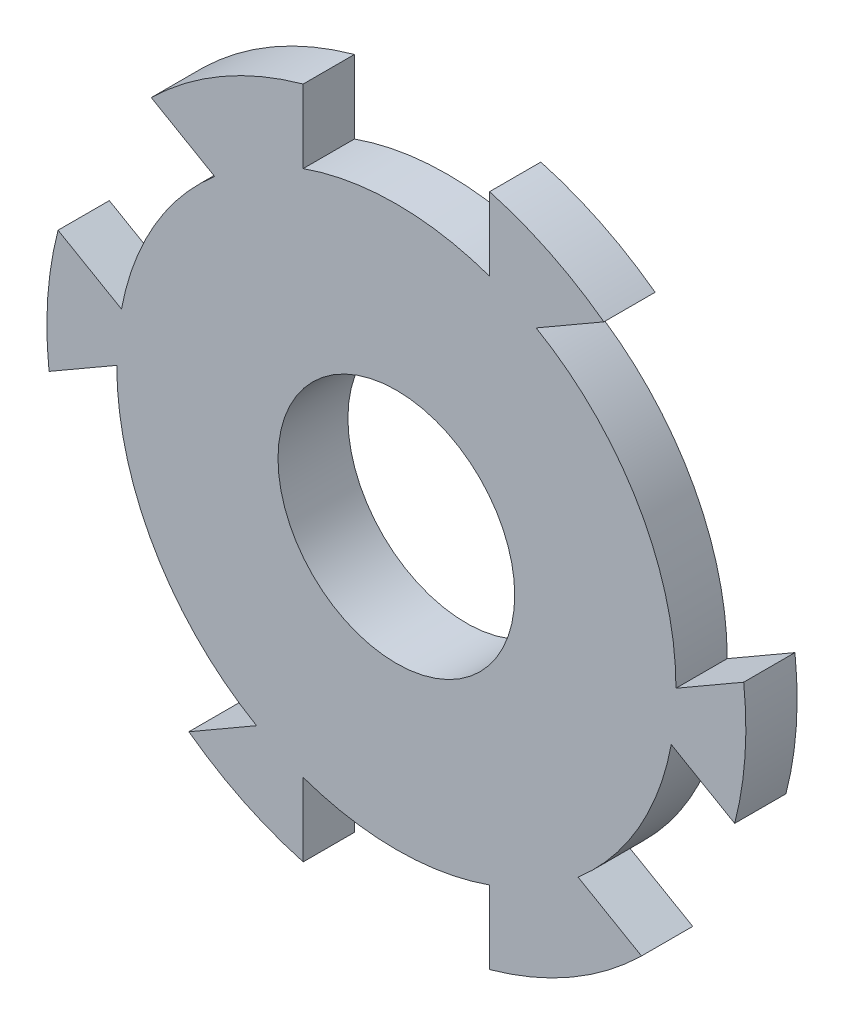
ISO-10303-21;
HEADER;
FILE_DESCRIPTION(('STEP AP214'),'2;1');
FILE_NAME('part.step','',(''),(''),'','','');
FILE_SCHEMA(('AUTOMOTIVE_DESIGN { 1 0 10303 214 1 1 1 1 }'));
ENDSEC;
DATA;
#1=APPLICATION_CONTEXT('core data for automotive mechanical design processes');
#2=APPLICATION_PROTOCOL_DEFINITION('international standard','automotive_design',2000,#1);
#3=PRODUCT_CONTEXT('',#1,'mechanical');
#4=PRODUCT('Part','Part','',(#3));
#5=PRODUCT_RELATED_PRODUCT_CATEGORY('part','',(#4));
#6=PRODUCT_DEFINITION_FORMATION('','',#4);
#7=PRODUCT_DEFINITION_CONTEXT('part definition',#1,'design');
#8=PRODUCT_DEFINITION('design','',#6,#7);
#9=PRODUCT_DEFINITION_SHAPE('','',#8);
#10=(LENGTH_UNIT() NAMED_UNIT(*) SI_UNIT(.MILLI.,.METRE.));
#11=(NAMED_UNIT(*) PLANE_ANGLE_UNIT() SI_UNIT($,.RADIAN.));
#12=(NAMED_UNIT(*) SI_UNIT($,.STERADIAN.) SOLID_ANGLE_UNIT());
#13=UNCERTAINTY_MEASURE_WITH_UNIT(LENGTH_MEASURE(1.E-05),#10,'distance_accuracy_value','');
#14=(GEOMETRIC_REPRESENTATION_CONTEXT(3) GLOBAL_UNCERTAINTY_ASSIGNED_CONTEXT((#13)) GLOBAL_UNIT_ASSIGNED_CONTEXT((#10,
#11,#12)) REPRESENTATION_CONTEXT('',''));
#15=CARTESIAN_POINT('',(0.,0.,0.));
#16=DIRECTION('',(0.,0.,1.));
#17=DIRECTION('',(1.,0.,0.));
#18=AXIS2_PLACEMENT_3D('',#15,#16,#17);
#19=CARTESIAN_POINT('',(0.,0.,0.));
#20=DIRECTION('',(0.,0.,1.));
#21=DIRECTION('',(1.,0.,0.));
#22=AXIS2_PLACEMENT_3D('',#19,#20,#21);
#23=PLANE('',#22);
#24=CARTESIAN_POINT('',(0.,0.,0.));
#25=DIRECTION('',(0.,0.,1.));
#26=DIRECTION('',(1.,0.,0.));
#27=AXIS2_PLACEMENT_3D('',#24,#25,#26);
#28=CIRCLE('',#27,7.62);
#29=CARTESIAN_POINT('',(-4.95170394666928,5.79180697404012,0.));
#30=VERTEX_POINT('',#29);
#31=CARTESIAN_POINT('',(-7.49170394666928,1.39239792281517,0.));
#32=VERTEX_POINT('',#31);
#33=EDGE_CURVE('E230',#30,#32,#28,.T.);
#34=ORIENTED_EDGE('',*,*,#33,.F.);
#35=DIRECTION('',(0.866025403784432,-0.500000000000011,0.));
#36=VECTOR('',#35,1.);
#37=CARTESIAN_POINT('',(-4.95170394666928,5.79180697404012,0.));
#38=LINE('',#37,#36);
#39=CARTESIAN_POINT('',(-6.68018985622362,6.78974877921182,0.));
#40=VERTEX_POINT('',#39);
#41=EDGE_CURVE('E135',#40,#30,#38,.T.);
#42=ORIENTED_EDGE('',*,*,#41,.F.);
#43=CARTESIAN_POINT('',(0.,0.,0.));
#44=DIRECTION('',(0.,0.,1.));
#45=DIRECTION('',(1.,0.,0.));
#46=AXIS2_PLACEMENT_3D('',#43,#44,#45);
#47=CIRCLE('',#46,9.52500000000004);
#48=CARTESIAN_POINT('',(-2.54000000000016,9.18008850719861,0.));
#49=VERTEX_POINT('',#48);
#50=EDGE_CURVE('E129',#49,#40,#47,.T.);
#51=ORIENTED_EDGE('',*,*,#50,.F.);
#52=DIRECTION('',(0.,1.,0.));
#53=VECTOR('',#52,1.);
#54=CARTESIAN_POINT('',(-2.54,7.18420489685532,0.));
#55=LINE('',#54,#53);
#56=CARTESIAN_POINT('',(-2.54,7.18420489685532,0.));
#57=VERTEX_POINT('',#56);
#58=EDGE_CURVE('E220',#57,#49,#55,.T.);
#59=ORIENTED_EDGE('',*,*,#58,.F.);
#60=CARTESIAN_POINT('',(0.,0.,0.));
#61=DIRECTION('',(0.,0.,1.));
#62=DIRECTION('',(1.,0.,0.));
#63=AXIS2_PLACEMENT_3D('',#60,#61,#62);
#64=CIRCLE('',#63,7.62);
#65=CARTESIAN_POINT('',(2.54,7.18420489685532,0.));
#66=VERTEX_POINT('',#65);
#67=EDGE_CURVE('E272',#66,#57,#64,.T.);
#68=ORIENTED_EDGE('',*,*,#67,.F.);
#69=DIRECTION('',(0.,-1.,0.));
#70=VECTOR('',#69,1.);
#71=CARTESIAN_POINT('',(2.54,7.18420489685532,0.));
#72=LINE('',#71,#70);
#73=CARTESIAN_POINT('',(2.53999999999985,9.18008850719866,0.));
#74=VERTEX_POINT('',#73);
#75=EDGE_CURVE('E270',#74,#66,#72,.T.);
#76=ORIENTED_EDGE('',*,*,#75,.F.);
#77=CARTESIAN_POINT('',(0.,0.,0.));
#78=DIRECTION('',(0.,0.,1.));
#79=DIRECTION('',(1.,0.,0.));
#80=AXIS2_PLACEMENT_3D('',#77,#78,#79);
#81=CIRCLE('',#80,9.52500000000004);
#82=CARTESIAN_POINT('',(5.65523437136697,7.66446013786427,0.));
#83=VERTEX_POINT('',#82);
#84=EDGE_CURVE('E268',#83,#74,#81,.T.);
#85=ORIENTED_EDGE('',*,*,#84,.F.);
#86=DIRECTION('',(0.866025403784419,0.500000000000034,0.));
#87=VECTOR('',#86,1.);
#88=CARTESIAN_POINT('',(3.80999999999992,6.59911357683747,0.));
#89=LINE('',#88,#87);
#90=CARTESIAN_POINT('',(3.80999999999992,6.59911357683747,0.));
#91=VERTEX_POINT('',#90);
#92=EDGE_CURVE('E266',#91,#83,#89,.T.);
#93=ORIENTED_EDGE('',*,*,#92,.F.);
#94=CARTESIAN_POINT('',(0.,0.,0.));
#95=DIRECTION('',(0.,0.,1.));
#96=DIRECTION('',(1.,0.,0.));
#97=AXIS2_PLACEMENT_3D('',#94,#95,#96);
#98=CIRCLE('',#97,7.62);
#99=CARTESIAN_POINT('',(7.62,0.,0.));
#100=VERTEX_POINT('',#99);
#101=EDGE_CURVE('E264',#100,#91,#98,.T.);
#102=ORIENTED_EDGE('',*,*,#101,.F.);
#103=DIRECTION('',(-0.866025403784411,-0.500000000000048,0.));
#104=VECTOR('',#103,1.);
#105=CARTESIAN_POINT('',(7.62,0.,0.));
#106=LINE('',#105,#104);
#107=CARTESIAN_POINT('',(9.46523437136711,1.06534656102697,0.));
#108=VERTEX_POINT('',#107);
#109=EDGE_CURVE('E262',#108,#100,#106,.T.);
#110=ORIENTED_EDGE('',*,*,#109,.F.);
#111=CARTESIAN_POINT('',(0.,0.,0.));
#112=DIRECTION('',(0.,0.,1.));
#113=DIRECTION('',(1.,0.,0.));
#114=AXIS2_PLACEMENT_3D('',#111,#112,#113);
#115=CIRCLE('',#114,9.52500000000007);
#116=CARTESIAN_POINT('',(9.22018985622369,-2.3903397279866,0.));
#117=VERTEX_POINT('',#116);
#118=EDGE_CURVE('E260',#117,#108,#115,.T.);
#119=ORIENTED_EDGE('',*,*,#118,.F.);
#120=DIRECTION('',(0.866025403784488,-0.499999999999914,0.));
#121=VECTOR('',#120,1.);
#122=CARTESIAN_POINT('',(7.49170394666929,-1.39239792281512,0.));
#123=LINE('',#122,#121);
#124=CARTESIAN_POINT('',(7.49170394666929,-1.39239792281512,0.));
#125=VERTEX_POINT('',#124);
#126=EDGE_CURVE('E258',#125,#117,#123,.T.);
#127=ORIENTED_EDGE('',*,*,#126,.F.);
#128=CARTESIAN_POINT('',(0.,0.,0.));
#129=DIRECTION('',(0.,0.,1.));
#130=DIRECTION('',(1.,0.,0.));
#131=AXIS2_PLACEMENT_3D('',#128,#129,#130);
#132=CIRCLE('',#131,7.62);
#133=CARTESIAN_POINT('',(4.95170394666932,-5.79180697404009,0.));
#134=VERTEX_POINT('',#133);
#135=EDGE_CURVE('E256',#134,#125,#132,.T.);
#136=ORIENTED_EDGE('',*,*,#135,.F.);
#137=DIRECTION('',(-0.866025403784475,0.499999999999938,0.));
#138=VECTOR('',#137,1.);
#139=CARTESIAN_POINT('',(4.95170394666932,-5.79180697404009,0.));
#140=LINE('',#139,#138);
#141=CARTESIAN_POINT('',(6.68018985622378,-6.78974877921167,0.));
#142=VERTEX_POINT('',#141);
#143=EDGE_CURVE('E254',#142,#134,#140,.T.);
#144=ORIENTED_EDGE('',*,*,#143,.F.);
#145=CARTESIAN_POINT('',(0.,0.,0.));
#146=DIRECTION('',(0.,0.,1.));
#147=DIRECTION('',(1.,0.,0.));
#148=AXIS2_PLACEMENT_3D('',#145,#146,#147);
#149=CIRCLE('',#148,9.52500000000004);
#150=CARTESIAN_POINT('',(2.54000000000022,-9.18008850719859,0.));
#151=VERTEX_POINT('',#150);
#152=EDGE_CURVE('E252',#151,#142,#149,.T.);
#153=ORIENTED_EDGE('',*,*,#152,.F.);
#154=DIRECTION('',(0.,-1.,0.));
#155=VECTOR('',#154,1.);
#156=CARTESIAN_POINT('',(2.54000000000005,-7.1842048968553,0.));
#157=LINE('',#156,#155);
#158=CARTESIAN_POINT('',(2.54000000000005,-7.1842048968553,0.));
#159=VERTEX_POINT('',#158);
#160=EDGE_CURVE('E250',#159,#151,#157,.T.);
#161=ORIENTED_EDGE('',*,*,#160,.F.);
#162=CARTESIAN_POINT('',(0.,0.,0.));
#163=DIRECTION('',(0.,0.,1.));
#164=DIRECTION('',(1.,0.,0.));
#165=AXIS2_PLACEMENT_3D('',#162,#163,#164);
#166=CIRCLE('',#165,7.62);
#167=CARTESIAN_POINT('',(-2.53999999999996,-7.18420489685534,0.));
#168=VERTEX_POINT('',#167);
#169=EDGE_CURVE('E248',#168,#159,#166,.T.);
#170=ORIENTED_EDGE('',*,*,#169,.F.);
#171=DIRECTION('',(0.,1.,0.));
#172=VECTOR('',#171,1.);
#173=CARTESIAN_POINT('',(-2.53999999999995,-7.18420489685534,0.));
#174=LINE('',#173,#172);
#175=CARTESIAN_POINT('',(-2.53999999999978,-9.18008850719868,0.));
#176=VERTEX_POINT('',#175);
#177=EDGE_CURVE('E246',#176,#168,#174,.T.);
#178=ORIENTED_EDGE('',*,*,#177,.F.);
#179=CARTESIAN_POINT('',(0.,0.,0.));
#180=DIRECTION('',(0.,0.,1.));
#181=DIRECTION('',(1.,0.,0.));
#182=AXIS2_PLACEMENT_3D('',#179,#180,#181);
#183=CIRCLE('',#182,9.52500000000004);
#184=CARTESIAN_POINT('',(-5.65523437136691,-7.66446013786431,0.));
#185=VERTEX_POINT('',#184);
#186=EDGE_CURVE('E244',#185,#176,#183,.T.);
#187=ORIENTED_EDGE('',*,*,#186,.F.);
#188=DIRECTION('',(-0.866025403784392,-0.500000000000081,0.));
#189=VECTOR('',#188,1.);
#190=CARTESIAN_POINT('',(-3.80999999999996,-6.59911357683745,0.));
#191=LINE('',#190,#189);
#192=CARTESIAN_POINT('',(-3.80999999999996,-6.59911357683745,0.));
#193=VERTEX_POINT('',#192);
#194=EDGE_CURVE('E242',#193,#185,#191,.T.);
#195=ORIENTED_EDGE('',*,*,#194,.F.);
#196=CARTESIAN_POINT('',(0.,0.,0.));
#197=DIRECTION('',(0.,0.,1.));
#198=DIRECTION('',(1.,0.,0.));
#199=AXIS2_PLACEMENT_3D('',#196,#197,#198);
#200=CIRCLE('',#199,7.62);
#201=CARTESIAN_POINT('',(-7.62,0.,0.));
#202=VERTEX_POINT('',#201);
#203=EDGE_CURVE('E240',#202,#193,#200,.T.);
#204=ORIENTED_EDGE('',*,*,#203,.F.);
#205=DIRECTION('',(0.866025403784404,0.50000000000006,0.));
#206=VECTOR('',#205,1.);
#207=CARTESIAN_POINT('',(-7.62,0.,0.));
#208=LINE('',#207,#206);
#209=CARTESIAN_POINT('',(-9.46523437136705,-1.06534656102692,0.));
#210=VERTEX_POINT('',#209);
#211=EDGE_CURVE('E238',#210,#202,#208,.T.);
#212=ORIENTED_EDGE('',*,*,#211,.F.);
#213=CARTESIAN_POINT('',(0.,0.,0.));
#214=DIRECTION('',(0.,0.,1.));
#215=DIRECTION('',(1.,0.,0.));
#216=AXIS2_PLACEMENT_3D('',#213,#214,#215);
#217=CIRCLE('',#216,9.52500000000004);
#218=CARTESIAN_POINT('',(-9.22018985622364,2.39033972798667,0.));
#219=VERTEX_POINT('',#218);
#220=EDGE_CURVE('E236',#219,#210,#217,.T.);
#221=ORIENTED_EDGE('',*,*,#220,.F.);
#222=DIRECTION('',(-0.866025403784481,0.499999999999927,0.));
#223=VECTOR('',#222,1.);
#224=CARTESIAN_POINT('',(-7.49170394666928,1.39239792281517,0.));
#225=LINE('',#224,#223);
#226=EDGE_CURVE('E233',#32,#219,#225,.T.);
#227=ORIENTED_EDGE('',*,*,#226,.F.);
#228=EDGE_LOOP('',(#34,#42,#51,#59,#68,#76,#85,#93,#102,#110,#119,#127,#136,#144,#153,#161,#170,
#178,#187,#195,#204,#212,#221,#227));
#229=FACE_BOUND('',#228,.T.);
#230=CARTESIAN_POINT('',(0.,0.,0.));
#231=DIRECTION('',(0.,0.,1.));
#232=DIRECTION('',(1.,0.,0.));
#233=AXIS2_PLACEMENT_3D('',#230,#231,#232);
#234=CIRCLE('',#233,4.7625);
#235=CARTESIAN_POINT('',(4.7625,0.,0.));
#236=VERTEX_POINT('',#235);
#237=EDGE_CURVE('E11',#236,#236,#234,.F.);
#238=ORIENTED_EDGE('',*,*,#237,.F.);
#239=EDGE_LOOP('',(#238));
#240=FACE_BOUND('',#239,.T.);
#241=ADVANCED_FACE('F35',(#229,#240),#23,.F.);
#242=CARTESIAN_POINT('',(0.,0.,1.397));
#243=DIRECTION('',(0.,0.,1.));
#244=DIRECTION('',(1.,0.,0.));
#245=AXIS2_PLACEMENT_3D('',#242,#243,#244);
#246=PLANE('',#245);
#247=CARTESIAN_POINT('',(0.,0.,1.397));
#248=DIRECTION('',(0.,0.,1.));
#249=DIRECTION('',(1.,0.,0.));
#250=AXIS2_PLACEMENT_3D('',#247,#248,#249);
#251=CIRCLE('',#250,7.62);
#252=CARTESIAN_POINT('',(-4.95170394666928,5.79180697404012,1.397));
#253=VERTEX_POINT('',#252);
#254=CARTESIAN_POINT('',(-7.49170394666928,1.39239792281517,1.397));
#255=VERTEX_POINT('',#254);
#256=EDGE_CURVE('E277',#253,#255,#251,.T.);
#257=ORIENTED_EDGE('',*,*,#256,.T.);
#258=DIRECTION('',(-0.866025403784481,0.499999999999927,0.));
#259=VECTOR('',#258,1.);
#260=CARTESIAN_POINT('',(-7.49170394666928,1.39239792281517,1.397));
#261=LINE('',#260,#259);
#262=CARTESIAN_POINT('',(-9.22018985622364,2.39033972798667,1.397));
#263=VERTEX_POINT('',#262);
#264=EDGE_CURVE('E144',#255,#263,#261,.T.);
#265=ORIENTED_EDGE('',*,*,#264,.T.);
#266=CARTESIAN_POINT('',(0.,0.,1.397));
#267=DIRECTION('',(0.,0.,1.));
#268=DIRECTION('',(1.,0.,0.));
#269=AXIS2_PLACEMENT_3D('',#266,#267,#268);
#270=CIRCLE('',#269,9.52500000000004);
#271=CARTESIAN_POINT('',(-9.46523437136705,-1.06534656102692,1.397));
#272=VERTEX_POINT('',#271);
#273=EDGE_CURVE('E358',#263,#272,#270,.T.);
#274=ORIENTED_EDGE('',*,*,#273,.T.);
#275=DIRECTION('',(0.866025403784404,0.50000000000006,0.));
#276=VECTOR('',#275,1.);
#277=CARTESIAN_POINT('',(-7.62,0.,1.397));
#278=LINE('',#277,#276);
#279=CARTESIAN_POINT('',(-7.62,0.,1.397));
#280=VERTEX_POINT('',#279);
#281=EDGE_CURVE('E355',#272,#280,#278,.T.);
#282=ORIENTED_EDGE('',*,*,#281,.T.);
#283=CARTESIAN_POINT('',(0.,0.,1.397));
#284=DIRECTION('',(0.,0.,1.));
#285=DIRECTION('',(1.,0.,0.));
#286=AXIS2_PLACEMENT_3D('',#283,#284,#285);
#287=CIRCLE('',#286,7.62);
#288=CARTESIAN_POINT('',(-3.80999999999996,-6.59911357683745,1.397));
#289=VERTEX_POINT('',#288);
#290=EDGE_CURVE('E357',#280,#289,#287,.T.);
#291=ORIENTED_EDGE('',*,*,#290,.T.);
#292=DIRECTION('',(-0.866025403784392,-0.500000000000081,0.));
#293=VECTOR('',#292,1.);
#294=CARTESIAN_POINT('',(-3.80999999999996,-6.59911357683745,1.397));
#295=LINE('',#294,#293);
#296=CARTESIAN_POINT('',(-5.65523437136691,-7.66446013786431,1.397));
#297=VERTEX_POINT('',#296);
#298=EDGE_CURVE('E360',#289,#297,#295,.T.);
#299=ORIENTED_EDGE('',*,*,#298,.T.);
#300=CARTESIAN_POINT('',(0.,0.,1.397));
#301=DIRECTION('',(0.,0.,1.));
#302=DIRECTION('',(1.,0.,0.));
#303=AXIS2_PLACEMENT_3D('',#300,#301,#302);
#304=CIRCLE('',#303,9.52500000000004);
#305=CARTESIAN_POINT('',(-2.53999999999978,-9.18008850719868,1.397));
#306=VERTEX_POINT('',#305);
#307=EDGE_CURVE('E366',#297,#306,#304,.T.);
#308=ORIENTED_EDGE('',*,*,#307,.T.);
#309=DIRECTION('',(0.,1.,0.));
#310=VECTOR('',#309,1.);
#311=CARTESIAN_POINT('',(-2.53999999999995,-7.18420489685534,1.397));
#312=LINE('',#311,#310);
#313=CARTESIAN_POINT('',(-2.53999999999996,-7.18420489685534,1.397));
#314=VERTEX_POINT('',#313);
#315=EDGE_CURVE('E368',#306,#314,#312,.T.);
#316=ORIENTED_EDGE('',*,*,#315,.T.);
#317=CARTESIAN_POINT('',(0.,0.,1.397));
#318=DIRECTION('',(0.,0.,1.));
#319=DIRECTION('',(1.,0.,0.));
#320=AXIS2_PLACEMENT_3D('',#317,#318,#319);
#321=CIRCLE('',#320,7.62);
#322=CARTESIAN_POINT('',(2.54000000000005,-7.1842048968553,1.397));
#323=VERTEX_POINT('',#322);
#324=EDGE_CURVE('E370',#314,#323,#321,.T.);
#325=ORIENTED_EDGE('',*,*,#324,.T.);
#326=DIRECTION('',(0.,-1.,0.));
#327=VECTOR('',#326,1.);
#328=CARTESIAN_POINT('',(2.54000000000005,-7.1842048968553,1.397));
#329=LINE('',#328,#327);
#330=CARTESIAN_POINT('',(2.54000000000022,-9.18008850719859,1.397));
#331=VERTEX_POINT('',#330);
#332=EDGE_CURVE('E372',#323,#331,#329,.T.);
#333=ORIENTED_EDGE('',*,*,#332,.T.);
#334=CARTESIAN_POINT('',(0.,0.,1.397));
#335=DIRECTION('',(0.,0.,1.));
#336=DIRECTION('',(1.,0.,0.));
#337=AXIS2_PLACEMENT_3D('',#334,#335,#336);
#338=CIRCLE('',#337,9.52500000000004);
#339=CARTESIAN_POINT('',(6.68018985622378,-6.78974877921167,1.397));
#340=VERTEX_POINT('',#339);
#341=EDGE_CURVE('E374',#331,#340,#338,.T.);
#342=ORIENTED_EDGE('',*,*,#341,.T.);
#343=DIRECTION('',(-0.866025403784475,0.499999999999938,0.));
#344=VECTOR('',#343,1.);
#345=CARTESIAN_POINT('',(4.95170394666932,-5.79180697404009,1.397));
#346=LINE('',#345,#344);
#347=CARTESIAN_POINT('',(4.95170394666932,-5.79180697404009,1.397));
#348=VERTEX_POINT('',#347);
#349=EDGE_CURVE('E376',#340,#348,#346,.T.);
#350=ORIENTED_EDGE('',*,*,#349,.T.);
#351=CARTESIAN_POINT('',(0.,0.,1.397));
#352=DIRECTION('',(0.,0.,1.));
#353=DIRECTION('',(1.,0.,0.));
#354=AXIS2_PLACEMENT_3D('',#351,#352,#353);
#355=CIRCLE('',#354,7.62);
#356=CARTESIAN_POINT('',(7.49170394666929,-1.39239792281512,1.397));
#357=VERTEX_POINT('',#356);
#358=EDGE_CURVE('E378',#348,#357,#355,.T.);
#359=ORIENTED_EDGE('',*,*,#358,.T.);
#360=DIRECTION('',(0.866025403784488,-0.499999999999914,0.));
#361=VECTOR('',#360,1.);
#362=CARTESIAN_POINT('',(7.49170394666929,-1.39239792281512,1.397));
#363=LINE('',#362,#361);
#364=CARTESIAN_POINT('',(9.22018985622369,-2.3903397279866,1.397));
#365=VERTEX_POINT('',#364);
#366=EDGE_CURVE('E380',#357,#365,#363,.T.);
#367=ORIENTED_EDGE('',*,*,#366,.T.);
#368=CARTESIAN_POINT('',(0.,0.,1.397));
#369=DIRECTION('',(0.,0.,1.));
#370=DIRECTION('',(1.,0.,0.));
#371=AXIS2_PLACEMENT_3D('',#368,#369,#370);
#372=CIRCLE('',#371,9.52500000000007);
#373=CARTESIAN_POINT('',(9.46523437136711,1.06534656102697,1.397));
#374=VERTEX_POINT('',#373);
#375=EDGE_CURVE('E382',#365,#374,#372,.T.);
#376=ORIENTED_EDGE('',*,*,#375,.T.);
#377=DIRECTION('',(-0.866025403784411,-0.500000000000048,0.));
#378=VECTOR('',#377,1.);
#379=CARTESIAN_POINT('',(7.62,0.,1.397));
#380=LINE('',#379,#378);
#381=CARTESIAN_POINT('',(7.62,0.,1.397));
#382=VERTEX_POINT('',#381);
#383=EDGE_CURVE('E384',#374,#382,#380,.T.);
#384=ORIENTED_EDGE('',*,*,#383,.T.);
#385=CARTESIAN_POINT('',(0.,0.,1.397));
#386=DIRECTION('',(0.,0.,1.));
#387=DIRECTION('',(1.,0.,0.));
#388=AXIS2_PLACEMENT_3D('',#385,#386,#387);
#389=CIRCLE('',#388,7.62);
#390=CARTESIAN_POINT('',(3.80999999999992,6.59911357683747,1.397));
#391=VERTEX_POINT('',#390);
#392=EDGE_CURVE('E386',#382,#391,#389,.T.);
#393=ORIENTED_EDGE('',*,*,#392,.T.);
#394=DIRECTION('',(0.866025403784419,0.500000000000034,0.));
#395=VECTOR('',#394,1.);
#396=CARTESIAN_POINT('',(3.80999999999992,6.59911357683747,1.397));
#397=LINE('',#396,#395);
#398=CARTESIAN_POINT('',(5.65523437136697,7.66446013786427,1.397));
#399=VERTEX_POINT('',#398);
#400=EDGE_CURVE('E388',#391,#399,#397,.T.);
#401=ORIENTED_EDGE('',*,*,#400,.T.);
#402=CARTESIAN_POINT('',(0.,0.,1.397));
#403=DIRECTION('',(0.,0.,1.));
#404=DIRECTION('',(1.,0.,0.));
#405=AXIS2_PLACEMENT_3D('',#402,#403,#404);
#406=CIRCLE('',#405,9.52500000000004);
#407=CARTESIAN_POINT('',(2.53999999999985,9.18008850719866,1.397));
#408=VERTEX_POINT('',#407);
#409=EDGE_CURVE('E390',#399,#408,#406,.T.);
#410=ORIENTED_EDGE('',*,*,#409,.T.);
#411=DIRECTION('',(0.,-1.,0.));
#412=VECTOR('',#411,1.);
#413=CARTESIAN_POINT('',(2.54,7.18420489685532,1.397));
#414=LINE('',#413,#412);
#415=CARTESIAN_POINT('',(2.54,7.18420489685532,1.397));
#416=VERTEX_POINT('',#415);
#417=EDGE_CURVE('E392',#408,#416,#414,.T.);
#418=ORIENTED_EDGE('',*,*,#417,.T.);
#419=CARTESIAN_POINT('',(0.,0.,1.397));
#420=DIRECTION('',(0.,0.,1.));
#421=DIRECTION('',(1.,0.,0.));
#422=AXIS2_PLACEMENT_3D('',#419,#420,#421);
#423=CIRCLE('',#422,7.62);
#424=CARTESIAN_POINT('',(-2.54,7.18420489685532,1.397));
#425=VERTEX_POINT('',#424);
#426=EDGE_CURVE('E212',#416,#425,#423,.T.);
#427=ORIENTED_EDGE('',*,*,#426,.T.);
#428=DIRECTION('',(0.,1.,0.));
#429=VECTOR('',#428,1.);
#430=CARTESIAN_POINT('',(-2.54,7.18420489685532,1.397));
#431=LINE('',#430,#429);
#432=CARTESIAN_POINT('',(-2.54000000000016,9.18008850719861,1.397));
#433=VERTEX_POINT('',#432);
#434=EDGE_CURVE('E205',#425,#433,#431,.T.);
#435=ORIENTED_EDGE('',*,*,#434,.T.);
#436=CARTESIAN_POINT('',(0.,0.,1.397));
#437=DIRECTION('',(0.,0.,1.));
#438=DIRECTION('',(1.,0.,0.));
#439=AXIS2_PLACEMENT_3D('',#436,#437,#438);
#440=CIRCLE('',#439,9.52500000000004);
#441=CARTESIAN_POINT('',(-6.68018985622362,6.78974877921182,1.397));
#442=VERTEX_POINT('',#441);
#443=EDGE_CURVE('E210',#433,#442,#440,.T.);
#444=ORIENTED_EDGE('',*,*,#443,.T.);
#445=DIRECTION('',(0.866025403784432,-0.500000000000011,0.));
#446=VECTOR('',#445,1.);
#447=CARTESIAN_POINT('',(-4.95170394666928,5.79180697404012,1.397));
#448=LINE('',#447,#446);
#449=EDGE_CURVE('E52',#442,#253,#448,.T.);
#450=ORIENTED_EDGE('',*,*,#449,.T.);
#451=EDGE_LOOP('',(#257,#265,#274,#282,#291,#299,#308,#316,#325,#333,#342,#350,#359,#367,#376,
#384,#393,#401,#410,#418,#427,#435,#444,#450));
#452=FACE_BOUND('',#451,.T.);
#453=CARTESIAN_POINT('',(0.,0.,1.397));
#454=DIRECTION('',(0.,0.,1.));
#455=DIRECTION('',(1.,0.,0.));
#456=AXIS2_PLACEMENT_3D('',#453,#454,#455);
#457=CIRCLE('',#456,3.2258);
#458=CARTESIAN_POINT('',(3.2258,0.,1.397));
#459=VERTEX_POINT('',#458);
#460=EDGE_CURVE('E234',#459,#459,#457,.T.);
#461=ORIENTED_EDGE('',*,*,#460,.F.);
#462=EDGE_LOOP('',(#461));
#463=FACE_BOUND('',#462,.T.);
#464=ADVANCED_FACE('F207',(#452,#463),#246,.T.);
#465=CARTESIAN_POINT('',(0.,0.,1.397));
#466=DIRECTION('',(0.,0.,-1.));
#467=DIRECTION('',(-1.,0.,0.));
#468=AXIS2_PLACEMENT_3D('',#465,#466,#467);
#469=CYLINDRICAL_SURFACE('',#468,7.62);
#470=ORIENTED_EDGE('',*,*,#33,.T.);
#471=DIRECTION('',(0.,0.,-1.));
#472=VECTOR('',#471,1.);
#473=CARTESIAN_POINT('',(-7.49170394666928,1.39239792281517,1.397));
#474=LINE('',#473,#472);
#475=EDGE_CURVE('E44',#255,#32,#474,.T.);
#476=ORIENTED_EDGE('',*,*,#475,.F.);
#477=ORIENTED_EDGE('',*,*,#256,.F.);
#478=DIRECTION('',(0.,0.,-1.));
#479=VECTOR('',#478,1.);
#480=CARTESIAN_POINT('',(-4.95170394666928,5.79180697404012,1.397));
#481=LINE('',#480,#479);
#482=EDGE_CURVE('E226',#253,#30,#481,.T.);
#483=ORIENTED_EDGE('',*,*,#482,.T.);
#484=EDGE_LOOP('',(#470,#476,#477,#483));
#485=FACE_BOUND('',#484,.T.);
#486=ADVANCED_FACE('F37',(#485),#469,.T.);
#487=CARTESIAN_POINT('',(-7.49170394666928,1.39239792281517,1.397));
#488=DIRECTION('',(-0.499999999999927,-0.866025403784481,0.));
#489=DIRECTION('',(0.866025403784481,-0.499999999999927,0.));
#490=AXIS2_PLACEMENT_3D('',#487,#488,#489);
#491=PLANE('',#490);
#492=ORIENTED_EDGE('',*,*,#226,.T.);
#493=DIRECTION('',(0.,0.,-1.));
#494=VECTOR('',#493,1.);
#495=CARTESIAN_POINT('',(-9.22018985622364,2.39033972798667,1.397));
#496=LINE('',#495,#494);
#497=EDGE_CURVE('E335',#263,#219,#496,.T.);
#498=ORIENTED_EDGE('',*,*,#497,.F.);
#499=ORIENTED_EDGE('',*,*,#264,.F.);
#500=ORIENTED_EDGE('',*,*,#475,.T.);
#501=EDGE_LOOP('',(#492,#498,#499,#500));
#502=FACE_BOUND('',#501,.T.);
#503=ADVANCED_FACE('F338',(#502),#491,.F.);
#504=CARTESIAN_POINT('',(0.,0.,1.397));
#505=DIRECTION('',(0.,0.,-1.));
#506=DIRECTION('',(-1.,0.,0.));
#507=AXIS2_PLACEMENT_3D('',#504,#505,#506);
#508=CYLINDRICAL_SURFACE('',#507,9.52500000000004);
#509=ORIENTED_EDGE('',*,*,#220,.T.);
#510=DIRECTION('',(0.,0.,-1.));
#511=VECTOR('',#510,1.);
#512=CARTESIAN_POINT('',(-9.46523437136705,-1.06534656102692,1.397));
#513=LINE('',#512,#511);
#514=EDGE_CURVE('E332',#272,#210,#513,.T.);
#515=ORIENTED_EDGE('',*,*,#514,.F.);
#516=ORIENTED_EDGE('',*,*,#273,.F.);
#517=ORIENTED_EDGE('',*,*,#497,.T.);
#518=EDGE_LOOP('',(#509,#515,#516,#517));
#519=FACE_BOUND('',#518,.T.);
#520=ADVANCED_FACE('F349',(#519),#508,.T.);
#521=CARTESIAN_POINT('',(-7.62,0.,1.397));
#522=DIRECTION('',(-0.50000000000006,0.866025403784404,0.));
#523=DIRECTION('',(-0.866025403784404,-0.50000000000006,0.));
#524=AXIS2_PLACEMENT_3D('',#521,#522,#523);
#525=PLANE('',#524);
#526=ORIENTED_EDGE('',*,*,#211,.T.);
#527=DIRECTION('',(0.,0.,-1.));
#528=VECTOR('',#527,1.);
#529=CARTESIAN_POINT('',(-7.62,0.,1.397));
#530=LINE('',#529,#528);
#531=EDGE_CURVE('E329',#280,#202,#530,.T.);
#532=ORIENTED_EDGE('',*,*,#531,.F.);
#533=ORIENTED_EDGE('',*,*,#281,.F.);
#534=ORIENTED_EDGE('',*,*,#514,.T.);
#535=EDGE_LOOP('',(#526,#532,#533,#534));
#536=FACE_BOUND('',#535,.T.);
#537=ADVANCED_FACE('F353',(#536),#525,.F.);
#538=CARTESIAN_POINT('',(0.,0.,1.397));
#539=DIRECTION('',(0.,0.,-1.));
#540=DIRECTION('',(-1.,0.,0.));
#541=AXIS2_PLACEMENT_3D('',#538,#539,#540);
#542=CYLINDRICAL_SURFACE('',#541,7.62);
#543=ORIENTED_EDGE('',*,*,#203,.T.);
#544=DIRECTION('',(0.,0.,-1.));
#545=VECTOR('',#544,1.);
#546=CARTESIAN_POINT('',(-3.80999999999996,-6.59911357683745,1.397));
#547=LINE('',#546,#545);
#548=EDGE_CURVE('E326',#289,#193,#547,.T.);
#549=ORIENTED_EDGE('',*,*,#548,.F.);
#550=ORIENTED_EDGE('',*,*,#290,.F.);
#551=ORIENTED_EDGE('',*,*,#531,.T.);
#552=EDGE_LOOP('',(#543,#549,#550,#551));
#553=FACE_BOUND('',#552,.T.);
#554=ADVANCED_FACE('F473',(#553),#542,.T.);
#555=CARTESIAN_POINT('',(-3.80999999999996,-6.59911357683745,1.397));
#556=DIRECTION('',(0.500000000000081,-0.866025403784392,0.));
#557=DIRECTION('',(0.866025403784392,0.500000000000081,0.));
#558=AXIS2_PLACEMENT_3D('',#555,#556,#557);
#559=PLANE('',#558);
#560=ORIENTED_EDGE('',*,*,#194,.T.);
#561=DIRECTION('',(0.,0.,-1.));
#562=VECTOR('',#561,1.);
#563=CARTESIAN_POINT('',(-5.65523437136691,-7.66446013786431,1.397));
#564=LINE('',#563,#562);
#565=EDGE_CURVE('E323',#297,#185,#564,.T.);
#566=ORIENTED_EDGE('',*,*,#565,.F.);
#567=ORIENTED_EDGE('',*,*,#298,.F.);
#568=ORIENTED_EDGE('',*,*,#548,.T.);
#569=EDGE_LOOP('',(#560,#566,#567,#568));
#570=FACE_BOUND('',#569,.T.);
#571=ADVANCED_FACE('F470',(#570),#559,.F.);
#572=CARTESIAN_POINT('',(0.,0.,1.397));
#573=DIRECTION('',(0.,0.,-1.));
#574=DIRECTION('',(-1.,0.,0.));
#575=AXIS2_PLACEMENT_3D('',#572,#573,#574);
#576=CYLINDRICAL_SURFACE('',#575,9.52500000000004);
#577=ORIENTED_EDGE('',*,*,#186,.T.);
#578=DIRECTION('',(0.,0.,-1.));
#579=VECTOR('',#578,1.);
#580=CARTESIAN_POINT('',(-2.53999999999978,-9.18008850719868,1.397));
#581=LINE('',#580,#579);
#582=EDGE_CURVE('E320',#306,#176,#581,.T.);
#583=ORIENTED_EDGE('',*,*,#582,.F.);
#584=ORIENTED_EDGE('',*,*,#307,.F.);
#585=ORIENTED_EDGE('',*,*,#565,.T.);
#586=EDGE_LOOP('',(#577,#583,#584,#585));
#587=FACE_BOUND('',#586,.T.);
#588=ADVANCED_FACE('F465',(#587),#576,.T.);
#589=CARTESIAN_POINT('',(-2.53999999999995,-7.18420489685534,1.397));
#590=DIRECTION('',(-1.,0.,0.));
#591=DIRECTION('',(0.,-1.,0.));
#592=AXIS2_PLACEMENT_3D('',#589,#590,#591);
#593=PLANE('',#592);
#594=ORIENTED_EDGE('',*,*,#177,.T.);
#595=DIRECTION('',(0.,0.,-1.));
#596=VECTOR('',#595,1.);
#597=CARTESIAN_POINT('',(-2.53999999999996,-7.18420489685534,1.397));
#598=LINE('',#597,#596);
#599=EDGE_CURVE('E317',#314,#168,#598,.T.);
#600=ORIENTED_EDGE('',*,*,#599,.F.);
#601=ORIENTED_EDGE('',*,*,#315,.F.);
#602=ORIENTED_EDGE('',*,*,#582,.T.);
#603=EDGE_LOOP('',(#594,#600,#601,#602));
#604=FACE_BOUND('',#603,.T.);
#605=ADVANCED_FACE('F460',(#604),#593,.F.);
#606=CARTESIAN_POINT('',(0.,0.,1.397));
#607=DIRECTION('',(0.,0.,-1.));
#608=DIRECTION('',(-1.,0.,0.));
#609=AXIS2_PLACEMENT_3D('',#606,#607,#608);
#610=CYLINDRICAL_SURFACE('',#609,7.62);
#611=ORIENTED_EDGE('',*,*,#169,.T.);
#612=DIRECTION('',(0.,0.,-1.));
#613=VECTOR('',#612,1.);
#614=CARTESIAN_POINT('',(2.54000000000005,-7.1842048968553,1.397));
#615=LINE('',#614,#613);
#616=EDGE_CURVE('E314',#323,#159,#615,.T.);
#617=ORIENTED_EDGE('',*,*,#616,.F.);
#618=ORIENTED_EDGE('',*,*,#324,.F.);
#619=ORIENTED_EDGE('',*,*,#599,.T.);
#620=EDGE_LOOP('',(#611,#617,#618,#619));
#621=FACE_BOUND('',#620,.T.);
#622=ADVANCED_FACE('F456',(#621),#610,.T.);
#623=CARTESIAN_POINT('',(2.54000000000005,-7.1842048968553,1.397));
#624=DIRECTION('',(1.,0.,0.));
#625=DIRECTION('',(0.,1.,0.));
#626=AXIS2_PLACEMENT_3D('',#623,#624,#625);
#627=PLANE('',#626);
#628=ORIENTED_EDGE('',*,*,#160,.T.);
#629=DIRECTION('',(0.,0.,-1.));
#630=VECTOR('',#629,1.);
#631=CARTESIAN_POINT('',(2.54000000000022,-9.18008850719859,1.397));
#632=LINE('',#631,#630);
#633=EDGE_CURVE('E311',#331,#151,#632,.T.);
#634=ORIENTED_EDGE('',*,*,#633,.F.);
#635=ORIENTED_EDGE('',*,*,#332,.F.);
#636=ORIENTED_EDGE('',*,*,#616,.T.);
#637=EDGE_LOOP('',(#628,#634,#635,#636));
#638=FACE_BOUND('',#637,.T.);
#639=ADVANCED_FACE('F451',(#638),#627,.F.);
#640=CARTESIAN_POINT('',(0.,0.,1.397));
#641=DIRECTION('',(0.,0.,-1.));
#642=DIRECTION('',(-1.,0.,0.));
#643=AXIS2_PLACEMENT_3D('',#640,#641,#642);
#644=CYLINDRICAL_SURFACE('',#643,9.52500000000004);
#645=ORIENTED_EDGE('',*,*,#152,.T.);
#646=DIRECTION('',(0.,0.,-1.));
#647=VECTOR('',#646,1.);
#648=CARTESIAN_POINT('',(6.68018985622378,-6.78974877921167,1.397));
#649=LINE('',#648,#647);
#650=EDGE_CURVE('E308',#340,#142,#649,.T.);
#651=ORIENTED_EDGE('',*,*,#650,.F.);
#652=ORIENTED_EDGE('',*,*,#341,.F.);
#653=ORIENTED_EDGE('',*,*,#633,.T.);
#654=EDGE_LOOP('',(#645,#651,#652,#653));
#655=FACE_BOUND('',#654,.T.);
#656=ADVANCED_FACE('F445',(#655),#644,.T.);
#657=CARTESIAN_POINT('',(4.95170394666932,-5.79180697404009,1.397));
#658=DIRECTION('',(-0.499999999999938,-0.866025403784475,0.));
#659=DIRECTION('',(0.866025403784475,-0.499999999999938,0.));
#660=AXIS2_PLACEMENT_3D('',#657,#658,#659);
#661=PLANE('',#660);
#662=ORIENTED_EDGE('',*,*,#143,.T.);
#663=DIRECTION('',(0.,0.,-1.));
#664=VECTOR('',#663,1.);
#665=CARTESIAN_POINT('',(4.95170394666932,-5.79180697404009,1.397));
#666=LINE('',#665,#664);
#667=EDGE_CURVE('E305',#348,#134,#666,.T.);
#668=ORIENTED_EDGE('',*,*,#667,.F.);
#669=ORIENTED_EDGE('',*,*,#349,.F.);
#670=ORIENTED_EDGE('',*,*,#650,.T.);
#671=EDGE_LOOP('',(#662,#668,#669,#670));
#672=FACE_BOUND('',#671,.T.);
#673=ADVANCED_FACE('F441',(#672),#661,.F.);
#674=CARTESIAN_POINT('',(0.,0.,1.397));
#675=DIRECTION('',(0.,0.,-1.));
#676=DIRECTION('',(-1.,0.,0.));
#677=AXIS2_PLACEMENT_3D('',#674,#675,#676);
#678=CYLINDRICAL_SURFACE('',#677,7.62);
#679=ORIENTED_EDGE('',*,*,#135,.T.);
#680=DIRECTION('',(0.,0.,-1.));
#681=VECTOR('',#680,1.);
#682=CARTESIAN_POINT('',(7.49170394666929,-1.39239792281512,1.397));
#683=LINE('',#682,#681);
#684=EDGE_CURVE('E302',#357,#125,#683,.T.);
#685=ORIENTED_EDGE('',*,*,#684,.F.);
#686=ORIENTED_EDGE('',*,*,#358,.F.);
#687=ORIENTED_EDGE('',*,*,#667,.T.);
#688=EDGE_LOOP('',(#679,#685,#686,#687));
#689=FACE_BOUND('',#688,.T.);
#690=ADVANCED_FACE('F436',(#689),#678,.T.);
#691=CARTESIAN_POINT('',(7.49170394666929,-1.39239792281512,1.397));
#692=DIRECTION('',(0.499999999999914,0.866025403784488,0.));
#693=DIRECTION('',(-0.866025403784488,0.499999999999914,0.));
#694=AXIS2_PLACEMENT_3D('',#691,#692,#693);
#695=PLANE('',#694);
#696=ORIENTED_EDGE('',*,*,#126,.T.);
#697=DIRECTION('',(0.,0.,-1.));
#698=VECTOR('',#697,1.);
#699=CARTESIAN_POINT('',(9.22018985622369,-2.3903397279866,1.397));
#700=LINE('',#699,#698);
#701=EDGE_CURVE('E299',#365,#117,#700,.T.);
#702=ORIENTED_EDGE('',*,*,#701,.F.);
#703=ORIENTED_EDGE('',*,*,#366,.F.);
#704=ORIENTED_EDGE('',*,*,#684,.T.);
#705=EDGE_LOOP('',(#696,#702,#703,#704));
#706=FACE_BOUND('',#705,.T.);
#707=ADVANCED_FACE('F430',(#706),#695,.F.);
#708=CARTESIAN_POINT('',(0.,0.,1.397));
#709=DIRECTION('',(0.,0.,-1.));
#710=DIRECTION('',(-1.,0.,0.));
#711=AXIS2_PLACEMENT_3D('',#708,#709,#710);
#712=CYLINDRICAL_SURFACE('',#711,9.52500000000007);
#713=ORIENTED_EDGE('',*,*,#118,.T.);
#714=DIRECTION('',(0.,0.,-1.));
#715=VECTOR('',#714,1.);
#716=CARTESIAN_POINT('',(9.46523437136711,1.06534656102697,1.397));
#717=LINE('',#716,#715);
#718=EDGE_CURVE('E296',#374,#108,#717,.T.);
#719=ORIENTED_EDGE('',*,*,#718,.F.);
#720=ORIENTED_EDGE('',*,*,#375,.F.);
#721=ORIENTED_EDGE('',*,*,#701,.T.);
#722=EDGE_LOOP('',(#713,#719,#720,#721));
#723=FACE_BOUND('',#722,.T.);
#724=ADVANCED_FACE('F426',(#723),#712,.T.);
#725=CARTESIAN_POINT('',(7.62,0.,1.397));
#726=DIRECTION('',(0.500000000000048,-0.866025403784411,0.));
#727=DIRECTION('',(0.866025403784411,0.500000000000048,0.));
#728=AXIS2_PLACEMENT_3D('',#725,#726,#727);
#729=PLANE('',#728);
#730=ORIENTED_EDGE('',*,*,#109,.T.);
#731=DIRECTION('',(0.,0.,-1.));
#732=VECTOR('',#731,1.);
#733=CARTESIAN_POINT('',(7.62,0.,1.397));
#734=LINE('',#733,#732);
#735=EDGE_CURVE('E293',#382,#100,#734,.T.);
#736=ORIENTED_EDGE('',*,*,#735,.F.);
#737=ORIENTED_EDGE('',*,*,#383,.F.);
#738=ORIENTED_EDGE('',*,*,#718,.T.);
#739=EDGE_LOOP('',(#730,#736,#737,#738));
#740=FACE_BOUND('',#739,.T.);
#741=ADVANCED_FACE('F421',(#740),#729,.F.);
#742=CARTESIAN_POINT('',(0.,0.,1.397));
#743=DIRECTION('',(0.,0.,-1.));
#744=DIRECTION('',(-1.,0.,0.));
#745=AXIS2_PLACEMENT_3D('',#742,#743,#744);
#746=CYLINDRICAL_SURFACE('',#745,7.62);
#747=ORIENTED_EDGE('',*,*,#101,.T.);
#748=DIRECTION('',(0.,0.,-1.));
#749=VECTOR('',#748,1.);
#750=CARTESIAN_POINT('',(3.80999999999992,6.59911357683747,1.397));
#751=LINE('',#750,#749);
#752=EDGE_CURVE('E290',#391,#91,#751,.T.);
#753=ORIENTED_EDGE('',*,*,#752,.F.);
#754=ORIENTED_EDGE('',*,*,#392,.F.);
#755=ORIENTED_EDGE('',*,*,#735,.T.);
#756=EDGE_LOOP('',(#747,#753,#754,#755));
#757=FACE_BOUND('',#756,.T.);
#758=ADVANCED_FACE('F415',(#757),#746,.T.);
#759=CARTESIAN_POINT('',(3.80999999999992,6.59911357683747,1.397));
#760=DIRECTION('',(-0.500000000000034,0.866025403784419,0.));
#761=DIRECTION('',(-0.866025403784419,-0.500000000000034,0.));
#762=AXIS2_PLACEMENT_3D('',#759,#760,#761);
#763=PLANE('',#762);
#764=ORIENTED_EDGE('',*,*,#92,.T.);
#765=DIRECTION('',(0.,0.,-1.));
#766=VECTOR('',#765,1.);
#767=CARTESIAN_POINT('',(5.65523437136697,7.66446013786427,1.397));
#768=LINE('',#767,#766);
#769=EDGE_CURVE('E287',#399,#83,#768,.T.);
#770=ORIENTED_EDGE('',*,*,#769,.F.);
#771=ORIENTED_EDGE('',*,*,#400,.F.);
#772=ORIENTED_EDGE('',*,*,#752,.T.);
#773=EDGE_LOOP('',(#764,#770,#771,#772));
#774=FACE_BOUND('',#773,.T.);
#775=ADVANCED_FACE('F411',(#774),#763,.F.);
#776=CARTESIAN_POINT('',(0.,0.,1.397));
#777=DIRECTION('',(0.,0.,-1.));
#778=DIRECTION('',(-1.,0.,0.));
#779=AXIS2_PLACEMENT_3D('',#776,#777,#778);
#780=CYLINDRICAL_SURFACE('',#779,9.52500000000004);
#781=ORIENTED_EDGE('',*,*,#84,.T.);
#782=DIRECTION('',(0.,0.,-1.));
#783=VECTOR('',#782,1.);
#784=CARTESIAN_POINT('',(2.53999999999985,9.18008850719866,1.397));
#785=LINE('',#784,#783);
#786=EDGE_CURVE('E284',#408,#74,#785,.T.);
#787=ORIENTED_EDGE('',*,*,#786,.F.);
#788=ORIENTED_EDGE('',*,*,#409,.F.);
#789=ORIENTED_EDGE('',*,*,#769,.T.);
#790=EDGE_LOOP('',(#781,#787,#788,#789));
#791=FACE_BOUND('',#790,.T.);
#792=ADVANCED_FACE('F407',(#791),#780,.T.);
#793=CARTESIAN_POINT('',(2.54,7.18420489685532,1.397));
#794=DIRECTION('',(1.,0.,0.));
#795=DIRECTION('',(0.,1.,0.));
#796=AXIS2_PLACEMENT_3D('',#793,#794,#795);
#797=PLANE('',#796);
#798=ORIENTED_EDGE('',*,*,#75,.T.);
#799=DIRECTION('',(0.,0.,-1.));
#800=VECTOR('',#799,1.);
#801=CARTESIAN_POINT('',(2.54,7.18420489685532,1.397));
#802=LINE('',#801,#800);
#803=EDGE_CURVE('E281',#416,#66,#802,.T.);
#804=ORIENTED_EDGE('',*,*,#803,.F.);
#805=ORIENTED_EDGE('',*,*,#417,.F.);
#806=ORIENTED_EDGE('',*,*,#786,.T.);
#807=EDGE_LOOP('',(#798,#804,#805,#806));
#808=FACE_BOUND('',#807,.T.);
#809=ADVANCED_FACE('F398',(#808),#797,.F.);
#810=CARTESIAN_POINT('',(0.,0.,1.397));
#811=DIRECTION('',(0.,0.,-1.));
#812=DIRECTION('',(-1.,0.,0.));
#813=AXIS2_PLACEMENT_3D('',#810,#811,#812);
#814=CYLINDRICAL_SURFACE('',#813,7.62);
#815=ORIENTED_EDGE('',*,*,#67,.T.);
#816=DIRECTION('',(0.,0.,-1.));
#817=VECTOR('',#816,1.);
#818=CARTESIAN_POINT('',(-2.54,7.18420489685532,1.397));
#819=LINE('',#818,#817);
#820=EDGE_CURVE('E221',#425,#57,#819,.T.);
#821=ORIENTED_EDGE('',*,*,#820,.F.);
#822=ORIENTED_EDGE('',*,*,#426,.F.);
#823=ORIENTED_EDGE('',*,*,#803,.T.);
#824=EDGE_LOOP('',(#815,#821,#822,#823));
#825=FACE_BOUND('',#824,.T.);
#826=ADVANCED_FACE('F402',(#825),#814,.T.);
#827=CARTESIAN_POINT('',(-2.54,7.18420489685532,1.397));
#828=DIRECTION('',(-1.,0.,0.));
#829=DIRECTION('',(0.,-1.,0.));
#830=AXIS2_PLACEMENT_3D('',#827,#828,#829);
#831=PLANE('',#830);
#832=ORIENTED_EDGE('',*,*,#58,.T.);
#833=DIRECTION('',(0.,0.,-1.));
#834=VECTOR('',#833,1.);
#835=CARTESIAN_POINT('',(-2.54000000000016,9.18008850719861,1.397));
#836=LINE('',#835,#834);
#837=EDGE_CURVE('E217',#433,#49,#836,.T.);
#838=ORIENTED_EDGE('',*,*,#837,.F.);
#839=ORIENTED_EDGE('',*,*,#434,.F.);
#840=ORIENTED_EDGE('',*,*,#820,.T.);
#841=EDGE_LOOP('',(#832,#838,#839,#840));
#842=FACE_BOUND('',#841,.T.);
#843=ADVANCED_FACE('F218',(#842),#831,.F.);
#844=CARTESIAN_POINT('',(0.,0.,1.397));
#845=DIRECTION('',(0.,0.,-1.));
#846=DIRECTION('',(-1.,0.,0.));
#847=AXIS2_PLACEMENT_3D('',#844,#845,#846);
#848=CYLINDRICAL_SURFACE('',#847,9.52500000000004);
#849=ORIENTED_EDGE('',*,*,#50,.T.);
#850=DIRECTION('',(0.,0.,-1.));
#851=VECTOR('',#850,1.);
#852=CARTESIAN_POINT('',(-6.68018985622362,6.78974877921182,1.397));
#853=LINE('',#852,#851);
#854=EDGE_CURVE('E222',#442,#40,#853,.T.);
#855=ORIENTED_EDGE('',*,*,#854,.F.);
#856=ORIENTED_EDGE('',*,*,#443,.F.);
#857=ORIENTED_EDGE('',*,*,#837,.T.);
#858=EDGE_LOOP('',(#849,#855,#856,#857));
#859=FACE_BOUND('',#858,.T.);
#860=ADVANCED_FACE('F224',(#859),#848,.T.);
#861=CARTESIAN_POINT('',(-4.95170394666928,5.79180697404012,1.397));
#862=DIRECTION('',(0.500000000000011,0.866025403784432,0.));
#863=DIRECTION('',(-0.866025403784433,0.500000000000011,0.));
#864=AXIS2_PLACEMENT_3D('',#861,#862,#863);
#865=PLANE('',#864);
#866=ORIENTED_EDGE('',*,*,#41,.T.);
#867=ORIENTED_EDGE('',*,*,#482,.F.);
#868=ORIENTED_EDGE('',*,*,#449,.F.);
#869=ORIENTED_EDGE('',*,*,#854,.T.);
#870=EDGE_LOOP('',(#866,#867,#868,#869));
#871=FACE_BOUND('',#870,.T.);
#872=ADVANCED_FACE('F490',(#871),#865,.F.);
#873=CARTESIAN_POINT('',(0.,0.,1.397));
#874=DIRECTION('',(0.,0.,-1.));
#875=DIRECTION('',(-1.,0.,0.));
#876=AXIS2_PLACEMENT_3D('',#873,#874,#875);
#877=CYLINDRICAL_SURFACE('',#876,3.2258);
#878=ORIENTED_EDGE('',*,*,#460,.T.);
#879=EDGE_LOOP('',(#878));
#880=FACE_BOUND('',#879,.T.);
#881=CARTESIAN_POINT('',(0.,0.,-0.508));
#882=DIRECTION('',(0.,0.,-1.));
#883=DIRECTION('',(-1.,0.,0.));
#884=AXIS2_PLACEMENT_3D('',#881,#882,#883);
#885=CIRCLE('',#884,3.2258);
#886=CARTESIAN_POINT('',(-3.2258,0.,-0.508));
#887=VERTEX_POINT('',#886);
#888=EDGE_CURVE('E723',#887,#887,#885,.T.);
#889=ORIENTED_EDGE('',*,*,#888,.T.);
#890=EDGE_LOOP('',(#889));
#891=FACE_BOUND('',#890,.T.);
#892=ADVANCED_FACE('F493',(#880,#891),#877,.F.);
#893=CARTESIAN_POINT('',(0.,0.,-0.508));
#894=DIRECTION('',(0.,0.,-1.));
#895=DIRECTION('',(-1.,0.,0.));
#896=AXIS2_PLACEMENT_3D('',#893,#894,#895);
#897=PLANE('',#896);
#898=CARTESIAN_POINT('',(0.,0.,-0.508));
#899=DIRECTION('',(0.,0.,-1.));
#900=DIRECTION('',(-1.,0.,0.));
#901=AXIS2_PLACEMENT_3D('',#898,#899,#900);
#902=CIRCLE('',#901,4.7625);
#903=CARTESIAN_POINT('',(-4.7625,0.,-0.508));
#904=VERTEX_POINT('',#903);
#905=EDGE_CURVE('E721',#904,#904,#902,.T.);
#906=ORIENTED_EDGE('',*,*,#905,.T.);
#907=EDGE_LOOP('',(#906));
#908=FACE_BOUND('',#907,.T.);
#909=ORIENTED_EDGE('',*,*,#888,.F.);
#910=EDGE_LOOP('',(#909));
#911=FACE_BOUND('',#910,.T.);
#912=ADVANCED_FACE('F605',(#908,#911),#897,.T.);
#913=CARTESIAN_POINT('',(0.,0.,-0.508));
#914=DIRECTION('',(0.,0.,1.));
#915=DIRECTION('',(1.,0.,0.));
#916=AXIS2_PLACEMENT_3D('',#913,#914,#915);
#917=CYLINDRICAL_SURFACE('',#916,4.7625);
#918=ORIENTED_EDGE('',*,*,#905,.F.);
#919=EDGE_LOOP('',(#918));
#920=FACE_BOUND('',#919,.T.);
#921=ORIENTED_EDGE('',*,*,#237,.T.);
#922=EDGE_LOOP('',(#921));
#923=FACE_BOUND('',#922,.T.);
#924=ADVANCED_FACE('F612',(#920,#923),#917,.T.);
#925=CLOSED_SHELL('',(#241,#464,#486,#503,#520,#537,#554,#571,#588,#605,#622,#639,#656,#673,
#690,#707,#724,#741,#758,#775,#792,#809,#826,#843,#860,#872,#892,#912,#924));
#926=MANIFOLD_SOLID_BREP('B2',#925);
#927=ADVANCED_BREP_SHAPE_REPRESENTATION('',(#18,#926),#14);
#928=SHAPE_DEFINITION_REPRESENTATION(#9,#927);
ENDSEC;
END-ISO-10303-21;
